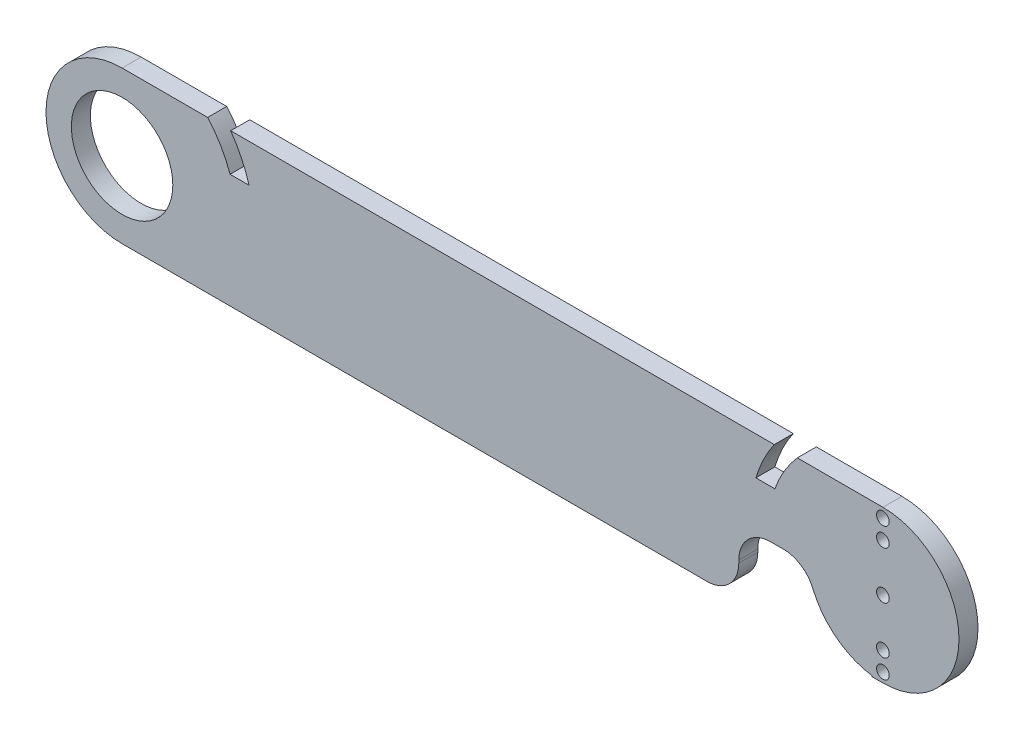
ISO-10303-21;
HEADER;
FILE_DESCRIPTION(('STEP AP214'),'2;1');
FILE_NAME('part.step','',(''),(''),'','','');
FILE_SCHEMA(('AUTOMOTIVE_DESIGN { 1 0 10303 214 1 1 1 1 }'));
ENDSEC;
DATA;
#1=APPLICATION_CONTEXT('core data for automotive mechanical design processes');
#2=APPLICATION_PROTOCOL_DEFINITION('international standard','automotive_design',2000,#1);
#3=PRODUCT_CONTEXT('',#1,'mechanical');
#4=PRODUCT('Part','Part','',(#3));
#5=PRODUCT_RELATED_PRODUCT_CATEGORY('part','',(#4));
#6=PRODUCT_DEFINITION_FORMATION('','',#4);
#7=PRODUCT_DEFINITION_CONTEXT('part definition',#1,'design');
#8=PRODUCT_DEFINITION('design','',#6,#7);
#9=PRODUCT_DEFINITION_SHAPE('','',#8);
#10=(LENGTH_UNIT() NAMED_UNIT(*) SI_UNIT(.MILLI.,.METRE.));
#11=(NAMED_UNIT(*) PLANE_ANGLE_UNIT() SI_UNIT($,.RADIAN.));
#12=(NAMED_UNIT(*) SI_UNIT($,.STERADIAN.) SOLID_ANGLE_UNIT());
#13=UNCERTAINTY_MEASURE_WITH_UNIT(LENGTH_MEASURE(1.E-05),#10,'distance_accuracy_value','');
#14=(GEOMETRIC_REPRESENTATION_CONTEXT(3) GLOBAL_UNCERTAINTY_ASSIGNED_CONTEXT((#13)) GLOBAL_UNIT_ASSIGNED_CONTEXT((#10,
#11,#12)) REPRESENTATION_CONTEXT('',''));
#15=CARTESIAN_POINT('',(0.,0.,0.));
#16=DIRECTION('',(0.,0.,1.));
#17=DIRECTION('',(1.,0.,0.));
#18=AXIS2_PLACEMENT_3D('',#15,#16,#17);
#19=CARTESIAN_POINT('',(0.,-12.,3.));
#20=DIRECTION('',(0.,1.,0.));
#21=DIRECTION('',(0.,0.,1.));
#22=AXIS2_PLACEMENT_3D('',#19,#20,#21);
#23=PLANE('',#22);
#24=DIRECTION('',(1.,0.,0.));
#25=VECTOR('',#24,1.);
#26=CARTESIAN_POINT('',(0.,-12.,3.));
#27=LINE('',#26,#25);
#28=CARTESIAN_POINT('',(-1.73119352280891,-12.,3.));
#29=VERTEX_POINT('',#28);
#30=CARTESIAN_POINT('',(0.,-12.,3.));
#31=VERTEX_POINT('',#30);
#32=EDGE_CURVE('E187',#29,#31,#27,.T.);
#33=ORIENTED_EDGE('',*,*,#32,.F.);
#34=DIRECTION('',(0.,0.,-1.));
#35=VECTOR('',#34,1.);
#36=CARTESIAN_POINT('',(-1.73119352280891,-12.,3.));
#37=LINE('',#36,#35);
#38=CARTESIAN_POINT('',(-1.73119352280891,-12.,0.));
#39=VERTEX_POINT('',#38);
#40=EDGE_CURVE('E170',#29,#39,#37,.T.);
#41=ORIENTED_EDGE('',*,*,#40,.T.);
#42=DIRECTION('',(1.,0.,0.));
#43=VECTOR('',#42,1.);
#44=CARTESIAN_POINT('',(0.,-12.,0.));
#45=LINE('',#44,#43);
#46=CARTESIAN_POINT('',(0.,-12.,0.));
#47=VERTEX_POINT('',#46);
#48=EDGE_CURVE('E215',#39,#47,#45,.T.);
#49=ORIENTED_EDGE('',*,*,#48,.T.);
#50=DIRECTION('',(0.,0.,-1.));
#51=VECTOR('',#50,1.);
#52=CARTESIAN_POINT('',(0.,-12.,3.));
#53=LINE('',#52,#51);
#54=EDGE_CURVE('E195',#31,#47,#53,.T.);
#55=ORIENTED_EDGE('',*,*,#54,.F.);
#56=EDGE_LOOP('',(#33,#41,#49,#55));
#57=FACE_BOUND('',#56,.T.);
#58=ADVANCED_FACE('F33',(#57),#23,.F.);
#59=CARTESIAN_POINT('',(0.,12.,3.));
#60=DIRECTION('',(0.,-1.,0.));
#61=DIRECTION('',(0.,0.,-1.));
#62=AXIS2_PLACEMENT_3D('',#59,#60,#61);
#63=PLANE('',#62);
#64=DIRECTION('',(-1.,0.,0.));
#65=VECTOR('',#64,1.);
#66=CARTESIAN_POINT('',(0.,12.,3.));
#67=LINE('',#66,#65);
#68=CARTESIAN_POINT('',(-106.5,12.,3.));
#69=VERTEX_POINT('',#68);
#70=CARTESIAN_POINT('',(-120.,12.,3.));
#71=VERTEX_POINT('',#70);
#72=EDGE_CURVE('E267',#69,#71,#67,.T.);
#73=ORIENTED_EDGE('',*,*,#72,.F.);
#74=DIRECTION('',(0.,0.,1.));
#75=VECTOR('',#74,1.);
#76=CARTESIAN_POINT('',(-106.5,12.,0.));
#77=LINE('',#76,#75);
#78=CARTESIAN_POINT('',(-106.5,12.,0.));
#79=VERTEX_POINT('',#78);
#80=EDGE_CURVE('E354',#79,#69,#77,.T.);
#81=ORIENTED_EDGE('',*,*,#80,.F.);
#82=DIRECTION('',(-1.,0.,0.));
#83=VECTOR('',#82,1.);
#84=CARTESIAN_POINT('',(0.,12.,0.));
#85=LINE('',#84,#83);
#86=CARTESIAN_POINT('',(-120.,12.,0.));
#87=VERTEX_POINT('',#86);
#88=EDGE_CURVE('E207',#79,#87,#85,.T.);
#89=ORIENTED_EDGE('',*,*,#88,.T.);
#90=DIRECTION('',(0.,0.,-1.));
#91=VECTOR('',#90,1.);
#92=CARTESIAN_POINT('',(-120.,12.,3.));
#93=LINE('',#92,#91);
#94=EDGE_CURVE('E224',#71,#87,#93,.T.);
#95=ORIENTED_EDGE('',*,*,#94,.F.);
#96=EDGE_LOOP('',(#73,#81,#89,#95));
#97=FACE_BOUND('',#96,.T.);
#98=ADVANCED_FACE('F290',(#97),#63,.F.);
#99=CARTESIAN_POINT('',(0.,12.,0.));
#100=VERTEX_POINT('',#99);
#101=CARTESIAN_POINT('',(-13.5,12.,0.));
#102=VERTEX_POINT('',#101);
#103=EDGE_CURVE('E209',#100,#102,#85,.T.);
#104=ORIENTED_EDGE('',*,*,#103,.T.);
#105=DIRECTION('',(0.,0.,1.));
#106=VECTOR('',#105,1.);
#107=CARTESIAN_POINT('',(-13.5,12.,0.));
#108=LINE('',#107,#106);
#109=CARTESIAN_POINT('',(-13.5,12.,3.));
#110=VERTEX_POINT('',#109);
#111=EDGE_CURVE('E373',#102,#110,#108,.T.);
#112=ORIENTED_EDGE('',*,*,#111,.T.);
#113=CARTESIAN_POINT('',(0.,12.,3.));
#114=VERTEX_POINT('',#113);
#115=EDGE_CURVE('E200',#114,#110,#67,.T.);
#116=ORIENTED_EDGE('',*,*,#115,.F.);
#117=DIRECTION('',(0.,0.,-1.));
#118=VECTOR('',#117,1.);
#119=CARTESIAN_POINT('',(0.,12.,3.));
#120=LINE('',#119,#118);
#121=EDGE_CURVE('E182',#114,#100,#120,.T.);
#122=ORIENTED_EDGE('',*,*,#121,.T.);
#123=EDGE_LOOP('',(#104,#112,#116,#122));
#124=FACE_BOUND('',#123,.T.);
#125=ADVANCED_FACE('F295',(#124),#63,.F.);
#126=CARTESIAN_POINT('',(0.,0.,3.));
#127=DIRECTION('',(0.,0.,1.));
#128=DIRECTION('',(1.,0.,0.));
#129=AXIS2_PLACEMENT_3D('',#126,#127,#128);
#130=PLANE('',#129);
#131=CARTESIAN_POINT('',(0.,10.5,3.));
#132=DIRECTION('',(0.,0.,1.));
#133=DIRECTION('',(1.,0.,0.));
#134=AXIS2_PLACEMENT_3D('',#131,#132,#133);
#135=CIRCLE('',#134,1.);
#136=CARTESIAN_POINT('',(1.,10.5,3.));
#137=VERTEX_POINT('',#136);
#138=EDGE_CURVE('E466',#137,#137,#135,.T.);
#139=ORIENTED_EDGE('',*,*,#138,.F.);
#140=EDGE_LOOP('',(#139));
#141=FACE_BOUND('',#140,.T.);
#142=CARTESIAN_POINT('',(0.,7.5,3.));
#143=DIRECTION('',(0.,0.,1.));
#144=DIRECTION('',(1.,0.,0.));
#145=AXIS2_PLACEMENT_3D('',#142,#143,#144);
#146=CIRCLE('',#145,1.);
#147=CARTESIAN_POINT('',(1.,7.5,3.));
#148=VERTEX_POINT('',#147);
#149=EDGE_CURVE('E463',#148,#148,#146,.T.);
#150=ORIENTED_EDGE('',*,*,#149,.F.);
#151=EDGE_LOOP('',(#150));
#152=FACE_BOUND('',#151,.T.);
#153=CARTESIAN_POINT('',(0.,-7.5,3.));
#154=DIRECTION('',(0.,0.,1.));
#155=DIRECTION('',(1.,0.,0.));
#156=AXIS2_PLACEMENT_3D('',#153,#154,#155);
#157=CIRCLE('',#156,1.);
#158=CARTESIAN_POINT('',(1.,-7.5,3.));
#159=VERTEX_POINT('',#158);
#160=EDGE_CURVE('E460',#159,#159,#157,.T.);
#161=ORIENTED_EDGE('',*,*,#160,.F.);
#162=EDGE_LOOP('',(#161));
#163=FACE_BOUND('',#162,.T.);
#164=CARTESIAN_POINT('',(0.,-10.5,3.));
#165=DIRECTION('',(0.,0.,1.));
#166=DIRECTION('',(1.,0.,0.));
#167=AXIS2_PLACEMENT_3D('',#164,#165,#166);
#168=CIRCLE('',#167,1.);
#169=CARTESIAN_POINT('',(1.,-10.5,3.));
#170=VERTEX_POINT('',#169);
#171=EDGE_CURVE('E457',#170,#170,#168,.T.);
#172=ORIENTED_EDGE('',*,*,#171,.F.);
#173=EDGE_LOOP('',(#172));
#174=FACE_BOUND('',#173,.T.);
#175=CARTESIAN_POINT('',(-120.,-12.,3.));
#176=VERTEX_POINT('',#175);
#177=CARTESIAN_POINT('',(-27.7311935228089,-12.,3.));
#178=VERTEX_POINT('',#177);
#179=EDGE_CURVE('E197',#176,#178,#27,.T.);
#180=ORIENTED_EDGE('',*,*,#179,.T.);
#181=CARTESIAN_POINT('',(-27.7311935228089,-7.,3.));
#182=DIRECTION('',(0.,0.,1.));
#183=DIRECTION('',(1.,0.,0.));
#184=AXIS2_PLACEMENT_3D('',#181,#182,#183);
#185=CIRCLE('',#184,5.);
#186=CARTESIAN_POINT('',(-22.7311935228089,-7.,3.));
#187=VERTEX_POINT('',#186);
#188=EDGE_CURVE('E55',#178,#187,#185,.T.);
#189=ORIENTED_EDGE('',*,*,#188,.T.);
#190=DIRECTION('',(0.,-1.,0.));
#191=VECTOR('',#190,1.);
#192=CARTESIAN_POINT('',(-22.7311935228089,-12.,3.));
#193=LINE('',#192,#191);
#194=CARTESIAN_POINT('',(-22.7311935228089,-6.57221453223144,3.));
#195=VERTEX_POINT('',#194);
#196=EDGE_CURVE('E192',#195,#187,#193,.T.);
#197=ORIENTED_EDGE('',*,*,#196,.F.);
#198=CARTESIAN_POINT('',(-17.7311935228089,-6.57221453223144,3.));
#199=DIRECTION('',(0.,0.,1.));
#200=DIRECTION('',(1.,0.,0.));
#201=AXIS2_PLACEMENT_3D('',#198,#199,#200);
#202=CIRCLE('',#201,5.);
#203=CARTESIAN_POINT('',(-17.7311935228089,-1.57221453223144,3.));
#204=VERTEX_POINT('',#203);
#205=EDGE_CURVE('E239',#195,#204,#202,.F.);
#206=ORIENTED_EDGE('',*,*,#205,.T.);
#207=DIRECTION('',(-1.,0.,0.));
#208=VECTOR('',#207,1.);
#209=CARTESIAN_POINT('',(-22.7311935228089,-1.57221453223144,3.));
#210=LINE('',#209,#208);
#211=CARTESIAN_POINT('',(-15.6608939090396,-1.57221453223144,3.));
#212=VERTEX_POINT('',#211);
#213=EDGE_CURVE('E476',#212,#204,#210,.T.);
#214=ORIENTED_EDGE('',*,*,#213,.F.);
#215=CARTESIAN_POINT('',(-15.6608939090396,-6.57221453223144,3.));
#216=DIRECTION('',(0.,0.,1.));
#217=DIRECTION('',(1.,0.,0.));
#218=AXIS2_PLACEMENT_3D('',#215,#216,#217);
#219=CIRCLE('',#218,5.);
#220=CARTESIAN_POINT('',(-11.0504201179325,-4.63739375977882,3.));
#221=VERTEX_POINT('',#220);
#222=EDGE_CURVE('E249',#212,#221,#219,.F.);
#223=ORIENTED_EDGE('',*,*,#222,.T.);
#224=CARTESIAN_POINT('',(0.,0.,3.));
#225=DIRECTION('',(0.,0.,-1.));
#226=DIRECTION('',(1.,0.,0.));
#227=AXIS2_PLACEMENT_3D('',#224,#225,#226);
#228=CIRCLE('',#227,11.9840396221826);
#229=CARTESIAN_POINT('',(-1.73119352280891,-11.8583377693767,3.));
#230=VERTEX_POINT('',#229);
#231=EDGE_CURVE('E190',#230,#221,#228,.T.);
#232=ORIENTED_EDGE('',*,*,#231,.F.);
#233=DIRECTION('',(0.,1.,0.));
#234=VECTOR('',#233,1.);
#235=CARTESIAN_POINT('',(-1.73119352280891,-11.8583377693767,3.));
#236=LINE('',#235,#234);
#237=EDGE_CURVE('E174',#29,#230,#236,.T.);
#238=ORIENTED_EDGE('',*,*,#237,.F.);
#239=ORIENTED_EDGE('',*,*,#32,.T.);
#240=CARTESIAN_POINT('',(0.,0.,3.));
#241=DIRECTION('',(0.,0.,1.));
#242=DIRECTION('',(1.,0.,0.));
#243=AXIS2_PLACEMENT_3D('',#240,#241,#242);
#244=CIRCLE('',#243,12.);
#245=EDGE_CURVE('E219',#31,#114,#244,.T.);
#246=ORIENTED_EDGE('',*,*,#245,.T.);
#247=ORIENTED_EDGE('',*,*,#115,.T.);
#248=CARTESIAN_POINT('',(0.,0.,3.));
#249=DIRECTION('',(0.,0.,-1.));
#250=DIRECTION('',(1.,0.,0.));
#251=AXIS2_PLACEMENT_3D('',#248,#249,#250);
#252=CIRCLE('',#251,18.0623918681884);
#253=CARTESIAN_POINT('',(-17.0367250374008,6.,3.));
#254=VERTEX_POINT('',#253);
#255=EDGE_CURVE('E331',#254,#110,#252,.T.);
#256=ORIENTED_EDGE('',*,*,#255,.F.);
#257=DIRECTION('',(1.,0.,0.));
#258=VECTOR('',#257,1.);
#259=CARTESIAN_POINT('',(-17.0367250374008,6.,3.));
#260=LINE('',#259,#258);
#261=CARTESIAN_POINT('',(-20.0367250374008,6.,3.));
#262=VERTEX_POINT('',#261);
#263=EDGE_CURVE('E367',#262,#254,#260,.T.);
#264=ORIENTED_EDGE('',*,*,#263,.F.);
#265=CARTESIAN_POINT('',(0.,0.,3.));
#266=DIRECTION('',(0.,0.,1.));
#267=DIRECTION('',(1.,0.,0.));
#268=AXIS2_PLACEMENT_3D('',#265,#266,#267);
#269=CIRCLE('',#268,20.915791886142);
#270=CARTESIAN_POINT('',(-17.1309763359945,12.,3.));
#271=VERTEX_POINT('',#270);
#272=EDGE_CURVE('E375',#271,#262,#269,.T.);
#273=ORIENTED_EDGE('',*,*,#272,.F.);
#274=CARTESIAN_POINT('',(-102.869023664005,12.,3.));
#275=VERTEX_POINT('',#274);
#276=EDGE_CURVE('E392',#271,#275,#67,.T.);
#277=ORIENTED_EDGE('',*,*,#276,.T.);
#278=CARTESIAN_POINT('',(-120.,0.,3.));
#279=DIRECTION('',(0.,0.,1.));
#280=DIRECTION('',(-1.,0.,0.));
#281=AXIS2_PLACEMENT_3D('',#278,#279,#280);
#282=CIRCLE('',#281,20.915791886142);
#283=CARTESIAN_POINT('',(-99.9632749625992,6.,3.));
#284=VERTEX_POINT('',#283);
#285=EDGE_CURVE('E339',#284,#275,#282,.T.);
#286=ORIENTED_EDGE('',*,*,#285,.F.);
#287=DIRECTION('',(1.,0.,0.));
#288=VECTOR('',#287,1.);
#289=CARTESIAN_POINT('',(-102.963274962599,6.,3.));
#290=LINE('',#289,#288);
#291=CARTESIAN_POINT('',(-102.963274962599,6.,3.));
#292=VERTEX_POINT('',#291);
#293=EDGE_CURVE('E349',#292,#284,#290,.T.);
#294=ORIENTED_EDGE('',*,*,#293,.F.);
#295=CARTESIAN_POINT('',(-120.,0.,3.));
#296=DIRECTION('',(0.,0.,-1.));
#297=DIRECTION('',(-1.,0.,0.));
#298=AXIS2_PLACEMENT_3D('',#295,#296,#297);
#299=CIRCLE('',#298,18.0623918681884);
#300=EDGE_CURVE('E346',#69,#292,#299,.T.);
#301=ORIENTED_EDGE('',*,*,#300,.F.);
#302=ORIENTED_EDGE('',*,*,#72,.T.);
#303=CARTESIAN_POINT('',(-120.,0.,3.));
#304=DIRECTION('',(0.,0.,1.));
#305=DIRECTION('',(1.,0.,0.));
#306=AXIS2_PLACEMENT_3D('',#303,#304,#305);
#307=CIRCLE('',#306,12.);
#308=EDGE_CURVE('E198',#71,#176,#307,.T.);
#309=ORIENTED_EDGE('',*,*,#308,.T.);
#310=EDGE_LOOP('',(#180,#189,#197,#206,#214,#223,#232,#238,#239,#246,#247,#256,#264,#273,#277,
#286,#294,#301,#302,#309));
#311=FACE_BOUND('',#310,.T.);
#312=CARTESIAN_POINT('',(-120.,0.,3.));
#313=DIRECTION('',(0.,0.,1.));
#314=DIRECTION('',(1.,0.,0.));
#315=AXIS2_PLACEMENT_3D('',#312,#313,#314);
#316=CIRCLE('',#315,8.00000000000001);
#317=CARTESIAN_POINT('',(-112.,0.,3.));
#318=VERTEX_POINT('',#317);
#319=EDGE_CURVE('E208',#318,#318,#316,.T.);
#320=ORIENTED_EDGE('',*,*,#319,.F.);
#321=EDGE_LOOP('',(#320));
#322=FACE_BOUND('',#321,.T.);
#323=CARTESIAN_POINT('',(0.,0.,3.));
#324=DIRECTION('',(0.,0.,1.));
#325=DIRECTION('',(1.,0.,0.));
#326=AXIS2_PLACEMENT_3D('',#323,#324,#325);
#327=CIRCLE('',#326,1.);
#328=CARTESIAN_POINT('',(1.,0.,3.));
#329=VERTEX_POINT('',#328);
#330=EDGE_CURVE('E469',#329,#329,#327,.T.);
#331=ORIENTED_EDGE('',*,*,#330,.F.);
#332=EDGE_LOOP('',(#331));
#333=FACE_BOUND('',#332,.T.);
#334=ADVANCED_FACE('F184',(#141,#152,#163,#174,#311,#322,#333),#130,.T.);
#335=CARTESIAN_POINT('',(0.,0.,0.));
#336=DIRECTION('',(0.,0.,1.));
#337=DIRECTION('',(1.,0.,0.));
#338=AXIS2_PLACEMENT_3D('',#335,#336,#337);
#339=PLANE('',#338);
#340=CARTESIAN_POINT('',(0.,10.5,0.));
#341=DIRECTION('',(0.,0.,-1.));
#342=DIRECTION('',(-1.,0.,0.));
#343=AXIS2_PLACEMENT_3D('',#340,#341,#342);
#344=CIRCLE('',#343,1.);
#345=CARTESIAN_POINT('',(-1.,10.5,0.));
#346=VERTEX_POINT('',#345);
#347=EDGE_CURVE('E440',#346,#346,#344,.T.);
#348=ORIENTED_EDGE('',*,*,#347,.F.);
#349=EDGE_LOOP('',(#348));
#350=FACE_BOUND('',#349,.T.);
#351=CARTESIAN_POINT('',(0.,7.5,0.));
#352=DIRECTION('',(0.,0.,-1.));
#353=DIRECTION('',(-1.,0.,0.));
#354=AXIS2_PLACEMENT_3D('',#351,#352,#353);
#355=CIRCLE('',#354,1.);
#356=CARTESIAN_POINT('',(-1.,7.5,0.));
#357=VERTEX_POINT('',#356);
#358=EDGE_CURVE('E444',#357,#357,#355,.T.);
#359=ORIENTED_EDGE('',*,*,#358,.F.);
#360=EDGE_LOOP('',(#359));
#361=FACE_BOUND('',#360,.T.);
#362=CARTESIAN_POINT('',(0.,-7.5,0.));
#363=DIRECTION('',(0.,0.,-1.));
#364=DIRECTION('',(-1.,0.,0.));
#365=AXIS2_PLACEMENT_3D('',#362,#363,#364);
#366=CIRCLE('',#365,1.);
#367=CARTESIAN_POINT('',(-1.,-7.5,0.));
#368=VERTEX_POINT('',#367);
#369=EDGE_CURVE('E448',#368,#368,#366,.T.);
#370=ORIENTED_EDGE('',*,*,#369,.F.);
#371=EDGE_LOOP('',(#370));
#372=FACE_BOUND('',#371,.T.);
#373=CARTESIAN_POINT('',(0.,-10.5,0.));
#374=DIRECTION('',(0.,0.,-1.));
#375=DIRECTION('',(-1.,0.,0.));
#376=AXIS2_PLACEMENT_3D('',#373,#374,#375);
#377=CIRCLE('',#376,1.);
#378=CARTESIAN_POINT('',(-1.,-10.5,0.));
#379=VERTEX_POINT('',#378);
#380=EDGE_CURVE('E451',#379,#379,#377,.T.);
#381=ORIENTED_EDGE('',*,*,#380,.F.);
#382=EDGE_LOOP('',(#381));
#383=FACE_BOUND('',#382,.T.);
#384=DIRECTION('',(0.,-1.,0.));
#385=VECTOR('',#384,1.);
#386=CARTESIAN_POINT('',(-22.7311935228089,0.,0.));
#387=LINE('',#386,#385);
#388=CARTESIAN_POINT('',(-22.7311935228089,-6.57221453223144,0.));
#389=VERTEX_POINT('',#388);
#390=CARTESIAN_POINT('',(-22.7311935228089,-7.,0.));
#391=VERTEX_POINT('',#390);
#392=EDGE_CURVE('E276',#389,#391,#387,.T.);
#393=ORIENTED_EDGE('',*,*,#392,.T.);
#394=CARTESIAN_POINT('',(-27.7311935228089,-7.,0.));
#395=DIRECTION('',(0.,0.,1.));
#396=DIRECTION('',(1.,0.,0.));
#397=AXIS2_PLACEMENT_3D('',#394,#395,#396);
#398=CIRCLE('',#397,5.);
#399=CARTESIAN_POINT('',(-27.7311935228089,-12.,0.));
#400=VERTEX_POINT('',#399);
#401=EDGE_CURVE('E11',#391,#400,#398,.F.);
#402=ORIENTED_EDGE('',*,*,#401,.T.);
#403=CARTESIAN_POINT('',(-120.,-12.,0.));
#404=VERTEX_POINT('',#403);
#405=EDGE_CURVE('E216',#404,#400,#45,.T.);
#406=ORIENTED_EDGE('',*,*,#405,.F.);
#407=CARTESIAN_POINT('',(-120.,0.,0.));
#408=DIRECTION('',(0.,0.,1.));
#409=DIRECTION('',(1.,0.,0.));
#410=AXIS2_PLACEMENT_3D('',#407,#408,#409);
#411=CIRCLE('',#410,12.);
#412=EDGE_CURVE('E212',#87,#404,#411,.T.);
#413=ORIENTED_EDGE('',*,*,#412,.F.);
#414=ORIENTED_EDGE('',*,*,#88,.F.);
#415=CARTESIAN_POINT('',(-120.,0.,0.));
#416=DIRECTION('',(0.,0.,-1.));
#417=DIRECTION('',(-1.,0.,0.));
#418=AXIS2_PLACEMENT_3D('',#415,#416,#417);
#419=CIRCLE('',#418,18.0623918681884);
#420=CARTESIAN_POINT('',(-102.963274962599,6.,0.));
#421=VERTEX_POINT('',#420);
#422=EDGE_CURVE('E335',#79,#421,#419,.T.);
#423=ORIENTED_EDGE('',*,*,#422,.T.);
#424=DIRECTION('',(1.,0.,0.));
#425=VECTOR('',#424,1.);
#426=CARTESIAN_POINT('',(-102.963274962599,6.,0.));
#427=LINE('',#426,#425);
#428=CARTESIAN_POINT('',(-99.9632749625992,6.,0.));
#429=VERTEX_POINT('',#428);
#430=EDGE_CURVE('E338',#421,#429,#427,.T.);
#431=ORIENTED_EDGE('',*,*,#430,.T.);
#432=CARTESIAN_POINT('',(-120.,0.,0.));
#433=DIRECTION('',(0.,0.,1.));
#434=DIRECTION('',(-1.,0.,0.));
#435=AXIS2_PLACEMENT_3D('',#432,#433,#434);
#436=CIRCLE('',#435,20.915791886142);
#437=CARTESIAN_POINT('',(-102.869023664005,12.,0.));
#438=VERTEX_POINT('',#437);
#439=EDGE_CURVE('E342',#429,#438,#436,.T.);
#440=ORIENTED_EDGE('',*,*,#439,.T.);
#441=CARTESIAN_POINT('',(-17.1309763359945,12.,0.));
#442=VERTEX_POINT('',#441);
#443=EDGE_CURVE('E213',#442,#438,#85,.T.);
#444=ORIENTED_EDGE('',*,*,#443,.F.);
#445=CARTESIAN_POINT('',(0.,0.,0.));
#446=DIRECTION('',(0.,0.,1.));
#447=DIRECTION('',(1.,0.,0.));
#448=AXIS2_PLACEMENT_3D('',#445,#446,#447);
#449=CIRCLE('',#448,20.915791886142);
#450=CARTESIAN_POINT('',(-20.0367250374008,6.,0.));
#451=VERTEX_POINT('',#450);
#452=EDGE_CURVE('E366',#442,#451,#449,.T.);
#453=ORIENTED_EDGE('',*,*,#452,.T.);
#454=DIRECTION('',(1.,0.,0.));
#455=VECTOR('',#454,1.);
#456=CARTESIAN_POINT('',(-17.0367250374008,6.,0.));
#457=LINE('',#456,#455);
#458=CARTESIAN_POINT('',(-17.0367250374008,6.,0.));
#459=VERTEX_POINT('',#458);
#460=EDGE_CURVE('E370',#451,#459,#457,.T.);
#461=ORIENTED_EDGE('',*,*,#460,.T.);
#462=CARTESIAN_POINT('',(0.,0.,0.));
#463=DIRECTION('',(0.,0.,-1.));
#464=DIRECTION('',(1.,0.,0.));
#465=AXIS2_PLACEMENT_3D('',#462,#463,#464);
#466=CIRCLE('',#465,18.0623918681884);
#467=EDGE_CURVE('E363',#459,#102,#466,.T.);
#468=ORIENTED_EDGE('',*,*,#467,.T.);
#469=ORIENTED_EDGE('',*,*,#103,.F.);
#470=CARTESIAN_POINT('',(0.,0.,0.));
#471=DIRECTION('',(0.,0.,1.));
#472=DIRECTION('',(1.,0.,0.));
#473=AXIS2_PLACEMENT_3D('',#470,#471,#472);
#474=CIRCLE('',#473,12.);
#475=EDGE_CURVE('E204',#47,#100,#474,.T.);
#476=ORIENTED_EDGE('',*,*,#475,.F.);
#477=ORIENTED_EDGE('',*,*,#48,.F.);
#478=DIRECTION('',(0.,1.,0.));
#479=VECTOR('',#478,1.);
#480=CARTESIAN_POINT('',(-1.73119352280889,0.,0.));
#481=LINE('',#480,#479);
#482=CARTESIAN_POINT('',(-1.73119352280891,-11.8583377693767,0.));
#483=VERTEX_POINT('',#482);
#484=EDGE_CURVE('E177',#39,#483,#481,.T.);
#485=ORIENTED_EDGE('',*,*,#484,.T.);
#486=CARTESIAN_POINT('',(0.,0.,0.));
#487=DIRECTION('',(0.,0.,1.));
#488=DIRECTION('',(1.,0.,0.));
#489=AXIS2_PLACEMENT_3D('',#486,#487,#488);
#490=CIRCLE('',#489,11.9840396221826);
#491=CARTESIAN_POINT('',(-11.0504201179325,-4.63739375977882,0.));
#492=VERTEX_POINT('',#491);
#493=EDGE_CURVE('E230',#483,#492,#490,.F.);
#494=ORIENTED_EDGE('',*,*,#493,.T.);
#495=CARTESIAN_POINT('',(-15.6608939090396,-6.57221453223144,0.));
#496=DIRECTION('',(0.,0.,1.));
#497=DIRECTION('',(1.,0.,0.));
#498=AXIS2_PLACEMENT_3D('',#495,#496,#497);
#499=CIRCLE('',#498,5.);
#500=CARTESIAN_POINT('',(-15.6608939090396,-1.57221453223144,0.));
#501=VERTEX_POINT('',#500);
#502=EDGE_CURVE('E251',#492,#501,#499,.T.);
#503=ORIENTED_EDGE('',*,*,#502,.T.);
#504=DIRECTION('',(-1.,0.,0.));
#505=VECTOR('',#504,1.);
#506=CARTESIAN_POINT('',(0.,-1.57221453223144,0.));
#507=LINE('',#506,#505);
#508=CARTESIAN_POINT('',(-17.7311935228089,-1.57221453223144,0.));
#509=VERTEX_POINT('',#508);
#510=EDGE_CURVE('E181',#501,#509,#507,.T.);
#511=ORIENTED_EDGE('',*,*,#510,.T.);
#512=CARTESIAN_POINT('',(-17.7311935228089,-6.57221453223144,0.));
#513=DIRECTION('',(0.,0.,1.));
#514=DIRECTION('',(1.,0.,0.));
#515=AXIS2_PLACEMENT_3D('',#512,#513,#514);
#516=CIRCLE('',#515,5.);
#517=EDGE_CURVE('E242',#509,#389,#516,.T.);
#518=ORIENTED_EDGE('',*,*,#517,.T.);
#519=EDGE_LOOP('',(#393,#402,#406,#413,#414,#423,#431,#440,#444,#453,#461,#468,#469,#476,#477,
#485,#494,#503,#511,#518));
#520=FACE_BOUND('',#519,.T.);
#521=CARTESIAN_POINT('',(-120.,0.,0.));
#522=DIRECTION('',(0.,0.,1.));
#523=DIRECTION('',(1.,0.,0.));
#524=AXIS2_PLACEMENT_3D('',#521,#522,#523);
#525=CIRCLE('',#524,8.00000000000001);
#526=CARTESIAN_POINT('',(-112.,0.,0.));
#527=VERTEX_POINT('',#526);
#528=EDGE_CURVE('E356',#527,#527,#525,.T.);
#529=ORIENTED_EDGE('',*,*,#528,.T.);
#530=EDGE_LOOP('',(#529));
#531=FACE_BOUND('',#530,.T.);
#532=CARTESIAN_POINT('',(0.,0.,0.));
#533=DIRECTION('',(0.,0.,1.));
#534=DIRECTION('',(1.,0.,0.));
#535=AXIS2_PLACEMENT_3D('',#532,#533,#534);
#536=CIRCLE('',#535,1.);
#537=CARTESIAN_POINT('',(1.,0.,0.));
#538=VERTEX_POINT('',#537);
#539=EDGE_CURVE('E470',#538,#538,#536,.T.);
#540=ORIENTED_EDGE('',*,*,#539,.T.);
#541=EDGE_LOOP('',(#540));
#542=FACE_BOUND('',#541,.T.);
#543=ADVANCED_FACE('F273',(#350,#361,#372,#383,#520,#531,#542),#339,.F.);
#544=CARTESIAN_POINT('',(0.,0.,3.));
#545=DIRECTION('',(0.,0.,-1.));
#546=DIRECTION('',(-1.,0.,0.));
#547=AXIS2_PLACEMENT_3D('',#544,#545,#546);
#548=CYLINDRICAL_SURFACE('',#547,12.);
#549=ORIENTED_EDGE('',*,*,#475,.T.);
#550=ORIENTED_EDGE('',*,*,#121,.F.);
#551=ORIENTED_EDGE('',*,*,#245,.F.);
#552=ORIENTED_EDGE('',*,*,#54,.T.);
#553=EDGE_LOOP('',(#549,#550,#551,#552));
#554=FACE_BOUND('',#553,.T.);
#555=ADVANCED_FACE('F313',(#554),#548,.T.);
#556=ORIENTED_EDGE('',*,*,#443,.T.);
#557=DIRECTION('',(0.,0.,1.));
#558=VECTOR('',#557,1.);
#559=CARTESIAN_POINT('',(-102.869023664005,12.,0.));
#560=LINE('',#559,#558);
#561=EDGE_CURVE('E357',#438,#275,#560,.T.);
#562=ORIENTED_EDGE('',*,*,#561,.T.);
#563=ORIENTED_EDGE('',*,*,#276,.F.);
#564=DIRECTION('',(0.,0.,1.));
#565=VECTOR('',#564,1.);
#566=CARTESIAN_POINT('',(-17.1309763359945,12.,0.));
#567=LINE('',#566,#565);
#568=EDGE_CURVE('E383',#442,#271,#567,.T.);
#569=ORIENTED_EDGE('',*,*,#568,.F.);
#570=EDGE_LOOP('',(#556,#562,#563,#569));
#571=FACE_BOUND('',#570,.T.);
#572=ADVANCED_FACE('F298',(#571),#63,.F.);
#573=CARTESIAN_POINT('',(-120.,0.,3.));
#574=DIRECTION('',(0.,0.,-1.));
#575=DIRECTION('',(-1.,0.,0.));
#576=AXIS2_PLACEMENT_3D('',#573,#574,#575);
#577=CYLINDRICAL_SURFACE('',#576,12.);
#578=ORIENTED_EDGE('',*,*,#412,.T.);
#579=DIRECTION('',(0.,0.,-1.));
#580=VECTOR('',#579,1.);
#581=CARTESIAN_POINT('',(-120.,-12.,3.));
#582=LINE('',#581,#580);
#583=EDGE_CURVE('E221',#176,#404,#582,.T.);
#584=ORIENTED_EDGE('',*,*,#583,.F.);
#585=ORIENTED_EDGE('',*,*,#308,.F.);
#586=ORIENTED_EDGE('',*,*,#94,.T.);
#587=EDGE_LOOP('',(#578,#584,#585,#586));
#588=FACE_BOUND('',#587,.T.);
#589=ADVANCED_FACE('F270',(#588),#577,.T.);
#590=ORIENTED_EDGE('',*,*,#405,.T.);
#591=DIRECTION('',(0.,0.,1.));
#592=VECTOR('',#591,1.);
#593=CARTESIAN_POINT('',(-27.7311935228089,-12.,3.));
#594=LINE('',#593,#592);
#595=EDGE_CURVE('E253',#400,#178,#594,.T.);
#596=ORIENTED_EDGE('',*,*,#595,.T.);
#597=ORIENTED_EDGE('',*,*,#179,.F.);
#598=ORIENTED_EDGE('',*,*,#583,.T.);
#599=EDGE_LOOP('',(#590,#596,#597,#598));
#600=FACE_BOUND('',#599,.T.);
#601=ADVANCED_FACE('F259',(#600),#23,.F.);
#602=CARTESIAN_POINT('',(-120.,0.,3.));
#603=DIRECTION('',(0.,0.,-1.));
#604=DIRECTION('',(-1.,0.,0.));
#605=AXIS2_PLACEMENT_3D('',#602,#603,#604);
#606=CYLINDRICAL_SURFACE('',#605,8.00000000000001);
#607=ORIENTED_EDGE('',*,*,#319,.T.);
#608=EDGE_LOOP('',(#607));
#609=FACE_BOUND('',#608,.T.);
#610=ORIENTED_EDGE('',*,*,#528,.F.);
#611=EDGE_LOOP('',(#610));
#612=FACE_BOUND('',#611,.T.);
#613=ADVANCED_FACE('F302',(#609,#612),#606,.F.);
#614=CARTESIAN_POINT('',(0.,0.,0.));
#615=DIRECTION('',(0.,0.,1.));
#616=DIRECTION('',(1.,0.,0.));
#617=AXIS2_PLACEMENT_3D('',#614,#615,#616);
#618=CYLINDRICAL_SURFACE('',#617,18.0623918681884);
#619=ORIENTED_EDGE('',*,*,#255,.T.);
#620=ORIENTED_EDGE('',*,*,#111,.F.);
#621=ORIENTED_EDGE('',*,*,#467,.F.);
#622=DIRECTION('',(0.,0.,1.));
#623=VECTOR('',#622,1.);
#624=CARTESIAN_POINT('',(-17.0367250374008,6.,0.));
#625=LINE('',#624,#623);
#626=EDGE_CURVE('E350',#459,#254,#625,.T.);
#627=ORIENTED_EDGE('',*,*,#626,.T.);
#628=EDGE_LOOP('',(#619,#620,#621,#627));
#629=FACE_BOUND('',#628,.T.);
#630=ADVANCED_FACE('F307',(#629),#618,.T.);
#631=CARTESIAN_POINT('',(-17.0367250374008,6.,0.));
#632=DIRECTION('',(0.,-1.,0.));
#633=DIRECTION('',(0.,0.,-1.));
#634=AXIS2_PLACEMENT_3D('',#631,#632,#633);
#635=PLANE('',#634);
#636=ORIENTED_EDGE('',*,*,#263,.T.);
#637=ORIENTED_EDGE('',*,*,#626,.F.);
#638=ORIENTED_EDGE('',*,*,#460,.F.);
#639=DIRECTION('',(0.,0.,1.));
#640=VECTOR('',#639,1.);
#641=CARTESIAN_POINT('',(-20.0367250374008,6.,0.));
#642=LINE('',#641,#640);
#643=EDGE_CURVE('E381',#451,#262,#642,.T.);
#644=ORIENTED_EDGE('',*,*,#643,.T.);
#645=EDGE_LOOP('',(#636,#637,#638,#644));
#646=FACE_BOUND('',#645,.T.);
#647=ADVANCED_FACE('F420',(#646),#635,.F.);
#648=CARTESIAN_POINT('',(0.,0.,0.));
#649=DIRECTION('',(0.,0.,1.));
#650=DIRECTION('',(1.,0.,0.));
#651=AXIS2_PLACEMENT_3D('',#648,#649,#650);
#652=CYLINDRICAL_SURFACE('',#651,20.915791886142);
#653=ORIENTED_EDGE('',*,*,#272,.T.);
#654=ORIENTED_EDGE('',*,*,#643,.F.);
#655=ORIENTED_EDGE('',*,*,#452,.F.);
#656=ORIENTED_EDGE('',*,*,#568,.T.);
#657=EDGE_LOOP('',(#653,#654,#655,#656));
#658=FACE_BOUND('',#657,.T.);
#659=ADVANCED_FACE('F413',(#658),#652,.F.);
#660=CARTESIAN_POINT('',(-120.,0.,0.));
#661=DIRECTION('',(0.,0.,1.));
#662=DIRECTION('',(1.,0.,0.));
#663=AXIS2_PLACEMENT_3D('',#660,#661,#662);
#664=CYLINDRICAL_SURFACE('',#663,18.0623918681884);
#665=ORIENTED_EDGE('',*,*,#300,.T.);
#666=DIRECTION('',(0.,0.,1.));
#667=VECTOR('',#666,1.);
#668=CARTESIAN_POINT('',(-102.963274962599,6.,0.));
#669=LINE('',#668,#667);
#670=EDGE_CURVE('E345',#421,#292,#669,.T.);
#671=ORIENTED_EDGE('',*,*,#670,.F.);
#672=ORIENTED_EDGE('',*,*,#422,.F.);
#673=ORIENTED_EDGE('',*,*,#80,.T.);
#674=EDGE_LOOP('',(#665,#671,#672,#673));
#675=FACE_BOUND('',#674,.T.);
#676=ADVANCED_FACE('F411',(#675),#664,.T.);
#677=CARTESIAN_POINT('',(-120.,0.,0.));
#678=DIRECTION('',(0.,0.,1.));
#679=DIRECTION('',(1.,0.,0.));
#680=AXIS2_PLACEMENT_3D('',#677,#678,#679);
#681=CYLINDRICAL_SURFACE('',#680,20.915791886142);
#682=ORIENTED_EDGE('',*,*,#285,.T.);
#683=ORIENTED_EDGE('',*,*,#561,.F.);
#684=ORIENTED_EDGE('',*,*,#439,.F.);
#685=DIRECTION('',(0.,0.,1.));
#686=VECTOR('',#685,1.);
#687=CARTESIAN_POINT('',(-99.9632749625992,6.,0.));
#688=LINE('',#687,#686);
#689=EDGE_CURVE('E360',#429,#284,#688,.T.);
#690=ORIENTED_EDGE('',*,*,#689,.T.);
#691=EDGE_LOOP('',(#682,#683,#684,#690));
#692=FACE_BOUND('',#691,.T.);
#693=ADVANCED_FACE('F405',(#692),#681,.F.);
#694=CARTESIAN_POINT('',(-102.963274962599,6.,0.));
#695=DIRECTION('',(0.,-1.,0.));
#696=DIRECTION('',(0.,0.,-1.));
#697=AXIS2_PLACEMENT_3D('',#694,#695,#696);
#698=PLANE('',#697);
#699=ORIENTED_EDGE('',*,*,#293,.T.);
#700=ORIENTED_EDGE('',*,*,#689,.F.);
#701=ORIENTED_EDGE('',*,*,#430,.F.);
#702=ORIENTED_EDGE('',*,*,#670,.T.);
#703=EDGE_LOOP('',(#699,#700,#701,#702));
#704=FACE_BOUND('',#703,.T.);
#705=ADVANCED_FACE('F408',(#704),#698,.F.);
#706=CARTESIAN_POINT('',(0.,0.,-7.));
#707=DIRECTION('',(0.,0.,1.));
#708=DIRECTION('',(1.,0.,0.));
#709=AXIS2_PLACEMENT_3D('',#706,#707,#708);
#710=CYLINDRICAL_SURFACE('',#709,11.9840396221826);
#711=ORIENTED_EDGE('',*,*,#231,.T.);
#712=DIRECTION('',(0.,0.,1.));
#713=VECTOR('',#712,1.);
#714=CARTESIAN_POINT('',(-11.0504201179325,-4.63739375977882,-7.));
#715=LINE('',#714,#713);
#716=EDGE_CURVE('E247',#221,#492,#715,.F.);
#717=ORIENTED_EDGE('',*,*,#716,.T.);
#718=ORIENTED_EDGE('',*,*,#493,.F.);
#719=DIRECTION('',(0.,0.,1.));
#720=VECTOR('',#719,1.);
#721=CARTESIAN_POINT('',(-1.73119352280891,-11.8583377693767,-7.));
#722=LINE('',#721,#720);
#723=EDGE_CURVE('E191',#483,#230,#722,.T.);
#724=ORIENTED_EDGE('',*,*,#723,.T.);
#725=EDGE_LOOP('',(#711,#717,#718,#724));
#726=FACE_BOUND('',#725,.T.);
#727=ADVANCED_FACE('F485',(#726),#710,.T.);
#728=CARTESIAN_POINT('',(-22.7311935228089,-1.57221453223144,-7.));
#729=DIRECTION('',(0.,1.,0.));
#730=DIRECTION('',(0.,0.,1.));
#731=AXIS2_PLACEMENT_3D('',#728,#729,#730);
#732=PLANE('',#731);
#733=ORIENTED_EDGE('',*,*,#510,.F.);
#734=DIRECTION('',(0.,0.,-1.));
#735=VECTOR('',#734,1.);
#736=CARTESIAN_POINT('',(-15.6608939090396,-1.57221453223144,3.));
#737=LINE('',#736,#735);
#738=EDGE_CURVE('E244',#501,#212,#737,.F.);
#739=ORIENTED_EDGE('',*,*,#738,.T.);
#740=ORIENTED_EDGE('',*,*,#213,.T.);
#741=DIRECTION('',(0.,0.,1.));
#742=VECTOR('',#741,1.);
#743=CARTESIAN_POINT('',(-17.7311935228089,-1.57221453223144,0.));
#744=LINE('',#743,#742);
#745=EDGE_CURVE('E236',#204,#509,#744,.F.);
#746=ORIENTED_EDGE('',*,*,#745,.T.);
#747=EDGE_LOOP('',(#733,#739,#740,#746));
#748=FACE_BOUND('',#747,.T.);
#749=ADVANCED_FACE('F480',(#748),#732,.F.);
#750=CARTESIAN_POINT('',(-1.73119352280891,-11.8583377693767,-7.));
#751=DIRECTION('',(1.,0.,0.));
#752=DIRECTION('',(0.,1.,0.));
#753=AXIS2_PLACEMENT_3D('',#750,#751,#752);
#754=PLANE('',#753);
#755=ORIENTED_EDGE('',*,*,#40,.F.);
#756=ORIENTED_EDGE('',*,*,#237,.T.);
#757=ORIENTED_EDGE('',*,*,#723,.F.);
#758=ORIENTED_EDGE('',*,*,#484,.F.);
#759=EDGE_LOOP('',(#755,#756,#757,#758));
#760=FACE_BOUND('',#759,.T.);
#761=ADVANCED_FACE('F172',(#760),#754,.F.);
#762=CARTESIAN_POINT('',(-22.7311935228089,-12.,-7.));
#763=DIRECTION('',(-1.,0.,0.));
#764=DIRECTION('',(0.,0.,1.));
#765=AXIS2_PLACEMENT_3D('',#762,#763,#764);
#766=PLANE('',#765);
#767=ORIENTED_EDGE('',*,*,#196,.T.);
#768=DIRECTION('',(0.,0.,1.));
#769=VECTOR('',#768,1.);
#770=CARTESIAN_POINT('',(-22.7311935228089,-7.,-7.));
#771=LINE('',#770,#769);
#772=EDGE_CURVE('E41',#187,#391,#771,.F.);
#773=ORIENTED_EDGE('',*,*,#772,.T.);
#774=ORIENTED_EDGE('',*,*,#392,.F.);
#775=DIRECTION('',(0.,0.,1.));
#776=VECTOR('',#775,1.);
#777=CARTESIAN_POINT('',(-22.7311935228089,-6.57221453223144,3.));
#778=LINE('',#777,#776);
#779=EDGE_CURVE('E233',#389,#195,#778,.T.);
#780=ORIENTED_EDGE('',*,*,#779,.T.);
#781=EDGE_LOOP('',(#767,#773,#774,#780));
#782=FACE_BOUND('',#781,.T.);
#783=ADVANCED_FACE('F320',(#782),#766,.F.);
#784=CARTESIAN_POINT('',(-17.7311935228089,-6.57221453223144,-7.));
#785=DIRECTION('',(0.,0.,-1.));
#786=DIRECTION('',(-1.,0.,0.));
#787=AXIS2_PLACEMENT_3D('',#784,#785,#786);
#788=CYLINDRICAL_SURFACE('',#787,5.);
#789=ORIENTED_EDGE('',*,*,#517,.F.);
#790=ORIENTED_EDGE('',*,*,#745,.F.);
#791=ORIENTED_EDGE('',*,*,#205,.F.);
#792=ORIENTED_EDGE('',*,*,#779,.F.);
#793=EDGE_LOOP('',(#789,#790,#791,#792));
#794=FACE_BOUND('',#793,.T.);
#795=ADVANCED_FACE('F287',(#794),#788,.F.);
#796=CARTESIAN_POINT('',(-15.6608939090396,-6.57221453223144,-7.));
#797=DIRECTION('',(0.,0.,1.));
#798=DIRECTION('',(1.,0.,0.));
#799=AXIS2_PLACEMENT_3D('',#796,#797,#798);
#800=CYLINDRICAL_SURFACE('',#799,5.);
#801=ORIENTED_EDGE('',*,*,#502,.F.);
#802=ORIENTED_EDGE('',*,*,#716,.F.);
#803=ORIENTED_EDGE('',*,*,#222,.F.);
#804=ORIENTED_EDGE('',*,*,#738,.F.);
#805=EDGE_LOOP('',(#801,#802,#803,#804));
#806=FACE_BOUND('',#805,.T.);
#807=ADVANCED_FACE('F279',(#806),#800,.F.);
#808=CARTESIAN_POINT('',(-27.7311935228089,-7.,3.));
#809=DIRECTION('',(0.,0.,1.));
#810=DIRECTION('',(1.,0.,0.));
#811=AXIS2_PLACEMENT_3D('',#808,#809,#810);
#812=CYLINDRICAL_SURFACE('',#811,5.);
#813=ORIENTED_EDGE('',*,*,#401,.F.);
#814=ORIENTED_EDGE('',*,*,#772,.F.);
#815=ORIENTED_EDGE('',*,*,#188,.F.);
#816=ORIENTED_EDGE('',*,*,#595,.F.);
#817=EDGE_LOOP('',(#813,#814,#815,#816));
#818=FACE_BOUND('',#817,.T.);
#819=ADVANCED_FACE('F35',(#818),#812,.T.);
#820=CARTESIAN_POINT('',(0.,0.,0.));
#821=DIRECTION('',(0.,0.,1.));
#822=DIRECTION('',(1.,0.,0.));
#823=AXIS2_PLACEMENT_3D('',#820,#821,#822);
#824=CYLINDRICAL_SURFACE('',#823,1.);
#825=ORIENTED_EDGE('',*,*,#539,.F.);
#826=EDGE_LOOP('',(#825));
#827=FACE_BOUND('',#826,.T.);
#828=ORIENTED_EDGE('',*,*,#330,.T.);
#829=EDGE_LOOP('',(#828));
#830=FACE_BOUND('',#829,.T.);
#831=ADVANCED_FACE('F278',(#827,#830),#824,.F.);
#832=CARTESIAN_POINT('',(0.,-10.5,10.));
#833=DIRECTION('',(0.,0.,-1.));
#834=DIRECTION('',(-1.,0.,0.));
#835=AXIS2_PLACEMENT_3D('',#832,#833,#834);
#836=CYLINDRICAL_SURFACE('',#835,1.);
#837=ORIENTED_EDGE('',*,*,#171,.T.);
#838=EDGE_LOOP('',(#837));
#839=FACE_BOUND('',#838,.T.);
#840=ORIENTED_EDGE('',*,*,#380,.T.);
#841=EDGE_LOOP('',(#840));
#842=FACE_BOUND('',#841,.T.);
#843=ADVANCED_FACE('F284',(#839,#842),#836,.F.);
#844=CARTESIAN_POINT('',(0.,-7.5,10.));
#845=DIRECTION('',(0.,0.,-1.));
#846=DIRECTION('',(-1.,0.,0.));
#847=AXIS2_PLACEMENT_3D('',#844,#845,#846);
#848=CYLINDRICAL_SURFACE('',#847,1.);
#849=ORIENTED_EDGE('',*,*,#160,.T.);
#850=EDGE_LOOP('',(#849));
#851=FACE_BOUND('',#850,.T.);
#852=ORIENTED_EDGE('',*,*,#369,.T.);
#853=EDGE_LOOP('',(#852));
#854=FACE_BOUND('',#853,.T.);
#855=ADVANCED_FACE('F520',(#851,#854),#848,.F.);
#856=CARTESIAN_POINT('',(0.,7.5,10.));
#857=DIRECTION('',(0.,0.,-1.));
#858=DIRECTION('',(-1.,0.,0.));
#859=AXIS2_PLACEMENT_3D('',#856,#857,#858);
#860=CYLINDRICAL_SURFACE('',#859,1.);
#861=ORIENTED_EDGE('',*,*,#149,.T.);
#862=EDGE_LOOP('',(#861));
#863=FACE_BOUND('',#862,.T.);
#864=ORIENTED_EDGE('',*,*,#358,.T.);
#865=EDGE_LOOP('',(#864));
#866=FACE_BOUND('',#865,.T.);
#867=ADVANCED_FACE('F530',(#863,#866),#860,.F.);
#868=CARTESIAN_POINT('',(0.,10.5,10.));
#869=DIRECTION('',(0.,0.,-1.));
#870=DIRECTION('',(-1.,0.,0.));
#871=AXIS2_PLACEMENT_3D('',#868,#869,#870);
#872=CYLINDRICAL_SURFACE('',#871,1.);
#873=ORIENTED_EDGE('',*,*,#138,.T.);
#874=EDGE_LOOP('',(#873));
#875=FACE_BOUND('',#874,.T.);
#876=ORIENTED_EDGE('',*,*,#347,.T.);
#877=EDGE_LOOP('',(#876));
#878=FACE_BOUND('',#877,.T.);
#879=ADVANCED_FACE('F540',(#875,#878),#872,.F.);
#880=CLOSED_SHELL('',(#58,#98,#125,#334,#543,#555,#572,#589,#601,#613,#630,#647,#659,#676,#693,
#705,#727,#749,#761,#783,#795,#807,#819,#831,#843,#855,#867,#879));
#881=MANIFOLD_SOLID_BREP('B2',#880);
#882=ADVANCED_BREP_SHAPE_REPRESENTATION('',(#18,#881),#14);
#883=SHAPE_DEFINITION_REPRESENTATION(#9,#882);
ENDSEC;
END-ISO-10303-21;
